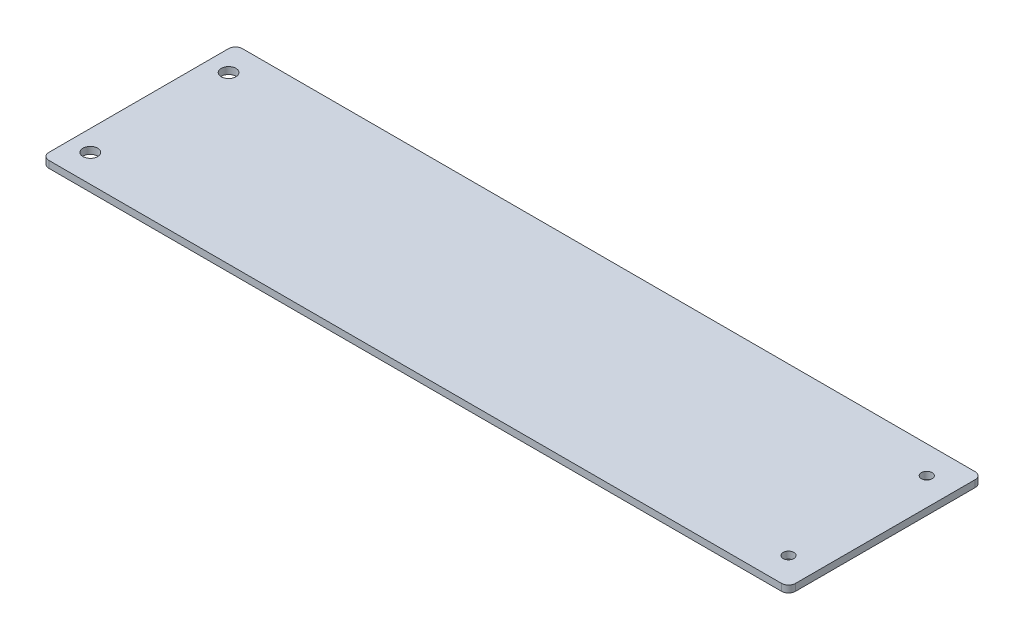
ISO-10303-21;
HEADER;
FILE_DESCRIPTION(('STEP AP214'),'2;1');
FILE_NAME('part.step','',(''),(''),'','','');
FILE_SCHEMA(('AUTOMOTIVE_DESIGN { 1 0 10303 214 1 1 1 1 }'));
ENDSEC;
DATA;
#1=APPLICATION_CONTEXT('core data for automotive mechanical design processes');
#2=APPLICATION_PROTOCOL_DEFINITION('international standard','automotive_design',2000,#1);
#3=PRODUCT_CONTEXT('',#1,'mechanical');
#4=PRODUCT('Part','Part','',(#3));
#5=PRODUCT_RELATED_PRODUCT_CATEGORY('part','',(#4));
#6=PRODUCT_DEFINITION_FORMATION('','',#4);
#7=PRODUCT_DEFINITION_CONTEXT('part definition',#1,'design');
#8=PRODUCT_DEFINITION('design','',#6,#7);
#9=PRODUCT_DEFINITION_SHAPE('','',#8);
#10=(LENGTH_UNIT() NAMED_UNIT(*) SI_UNIT(.MILLI.,.METRE.));
#11=(NAMED_UNIT(*) PLANE_ANGLE_UNIT() SI_UNIT($,.RADIAN.));
#12=(NAMED_UNIT(*) SI_UNIT($,.STERADIAN.) SOLID_ANGLE_UNIT());
#13=UNCERTAINTY_MEASURE_WITH_UNIT(LENGTH_MEASURE(1.E-05),#10,'distance_accuracy_value','');
#14=(GEOMETRIC_REPRESENTATION_CONTEXT(3) GLOBAL_UNCERTAINTY_ASSIGNED_CONTEXT((#13)) GLOBAL_UNIT_ASSIGNED_CONTEXT((#10,
#11,#12)) REPRESENTATION_CONTEXT('',''));
#15=CARTESIAN_POINT('',(0.,0.,0.));
#16=DIRECTION('',(0.,0.,1.));
#17=DIRECTION('',(1.,0.,0.));
#18=AXIS2_PLACEMENT_3D('',#15,#16,#17);
#19=CARTESIAN_POINT('',(171.45,3.175,44.45));
#20=DIRECTION('',(-1.,0.,0.));
#21=DIRECTION('',(0.,0.,1.));
#22=AXIS2_PLACEMENT_3D('',#19,#20,#21);
#23=PLANE('',#22);
#24=DIRECTION('',(0.,0.,-1.));
#25=VECTOR('',#24,1.);
#26=CARTESIAN_POINT('',(171.45,3.175,44.45));
#27=LINE('',#26,#25);
#28=CARTESIAN_POINT('',(171.45,3.175,41.275));
#29=VERTEX_POINT('',#28);
#30=CARTESIAN_POINT('',(171.45,3.175,-41.275));
#31=VERTEX_POINT('',#30);
#32=EDGE_CURVE('E138',#29,#31,#27,.T.);
#33=ORIENTED_EDGE('',*,*,#32,.F.);
#34=DIRECTION('',(0.,-1.,0.));
#35=VECTOR('',#34,1.);
#36=CARTESIAN_POINT('',(171.45,3.175,41.275));
#37=LINE('',#36,#35);
#38=CARTESIAN_POINT('',(171.45,0.,41.275));
#39=VERTEX_POINT('',#38);
#40=EDGE_CURVE('E11',#29,#39,#37,.T.);
#41=ORIENTED_EDGE('',*,*,#40,.T.);
#42=DIRECTION('',(0.,0.,-1.));
#43=VECTOR('',#42,1.);
#44=CARTESIAN_POINT('',(171.45,0.,44.45));
#45=LINE('',#44,#43);
#46=CARTESIAN_POINT('',(171.45,0.,-41.275));
#47=VERTEX_POINT('',#46);
#48=EDGE_CURVE('E140',#39,#47,#45,.T.);
#49=ORIENTED_EDGE('',*,*,#48,.T.);
#50=DIRECTION('',(0.,-1.,0.));
#51=VECTOR('',#50,1.);
#52=CARTESIAN_POINT('',(171.45,3.175,-41.275));
#53=LINE('',#52,#51);
#54=EDGE_CURVE('E45',#47,#31,#53,.F.);
#55=ORIENTED_EDGE('',*,*,#54,.T.);
#56=EDGE_LOOP('',(#33,#41,#49,#55));
#57=FACE_BOUND('',#56,.T.);
#58=ADVANCED_FACE('F36',(#57),#23,.F.);
#59=CARTESIAN_POINT('',(-171.45,3.175,-44.45));
#60=DIRECTION('',(0.,0.,1.));
#61=DIRECTION('',(1.,0.,0.));
#62=AXIS2_PLACEMENT_3D('',#59,#60,#61);
#63=PLANE('',#62);
#64=DIRECTION('',(-1.,0.,0.));
#65=VECTOR('',#64,1.);
#66=CARTESIAN_POINT('',(-171.45,0.,-44.45));
#67=LINE('',#66,#65);
#68=CARTESIAN_POINT('',(168.275,0.,-44.45));
#69=VERTEX_POINT('',#68);
#70=CARTESIAN_POINT('',(-168.275,0.,-44.45));
#71=VERTEX_POINT('',#70);
#72=EDGE_CURVE('E133',#69,#71,#67,.T.);
#73=ORIENTED_EDGE('',*,*,#72,.T.);
#74=DIRECTION('',(0.,-1.,0.));
#75=VECTOR('',#74,1.);
#76=CARTESIAN_POINT('',(-168.275,3.175,-44.45));
#77=LINE('',#76,#75);
#78=CARTESIAN_POINT('',(-168.275,3.175,-44.45));
#79=VERTEX_POINT('',#78);
#80=EDGE_CURVE('E109',#71,#79,#77,.F.);
#81=ORIENTED_EDGE('',*,*,#80,.T.);
#82=DIRECTION('',(-1.,0.,0.));
#83=VECTOR('',#82,1.);
#84=CARTESIAN_POINT('',(-171.45,3.175,-44.45));
#85=LINE('',#84,#83);
#86=CARTESIAN_POINT('',(168.275,3.175,-44.45));
#87=VERTEX_POINT('',#86);
#88=EDGE_CURVE('E191',#87,#79,#85,.T.);
#89=ORIENTED_EDGE('',*,*,#88,.F.);
#90=DIRECTION('',(0.,-1.,0.));
#91=VECTOR('',#90,1.);
#92=CARTESIAN_POINT('',(168.275,3.175,-44.45));
#93=LINE('',#92,#91);
#94=EDGE_CURVE('E115',#87,#69,#93,.T.);
#95=ORIENTED_EDGE('',*,*,#94,.T.);
#96=EDGE_LOOP('',(#73,#81,#89,#95));
#97=FACE_BOUND('',#96,.T.);
#98=ADVANCED_FACE('F195',(#97),#63,.F.);
#99=CARTESIAN_POINT('',(-171.45,3.175,44.45));
#100=DIRECTION('',(1.,0.,0.));
#101=DIRECTION('',(0.,0.,-1.));
#102=AXIS2_PLACEMENT_3D('',#99,#100,#101);
#103=PLANE('',#102);
#104=DIRECTION('',(0.,0.,1.));
#105=VECTOR('',#104,1.);
#106=CARTESIAN_POINT('',(-171.45,3.175,44.45));
#107=LINE('',#106,#105);
#108=CARTESIAN_POINT('',(-171.45,3.175,-41.275));
#109=VERTEX_POINT('',#108);
#110=CARTESIAN_POINT('',(-171.45,3.175,41.275));
#111=VERTEX_POINT('',#110);
#112=EDGE_CURVE('E124',#109,#111,#107,.T.);
#113=ORIENTED_EDGE('',*,*,#112,.F.);
#114=DIRECTION('',(0.,-1.,0.));
#115=VECTOR('',#114,1.);
#116=CARTESIAN_POINT('',(-171.45,3.175,-41.275));
#117=LINE('',#116,#115);
#118=CARTESIAN_POINT('',(-171.45,0.,-41.275));
#119=VERTEX_POINT('',#118);
#120=EDGE_CURVE('E108',#109,#119,#117,.T.);
#121=ORIENTED_EDGE('',*,*,#120,.T.);
#122=DIRECTION('',(0.,0.,1.));
#123=VECTOR('',#122,1.);
#124=CARTESIAN_POINT('',(-171.45,0.,44.45));
#125=LINE('',#124,#123);
#126=CARTESIAN_POINT('',(-171.45,0.,41.275));
#127=VERTEX_POINT('',#126);
#128=EDGE_CURVE('E122',#119,#127,#125,.T.);
#129=ORIENTED_EDGE('',*,*,#128,.T.);
#130=DIRECTION('',(0.,-1.,0.));
#131=VECTOR('',#130,1.);
#132=CARTESIAN_POINT('',(-171.45,3.175,41.275));
#133=LINE('',#132,#131);
#134=EDGE_CURVE('E127',#127,#111,#133,.F.);
#135=ORIENTED_EDGE('',*,*,#134,.T.);
#136=EDGE_LOOP('',(#113,#121,#129,#135));
#137=FACE_BOUND('',#136,.T.);
#138=ADVANCED_FACE('F121',(#137),#103,.F.);
#139=CARTESIAN_POINT('',(-171.45,3.175,44.45));
#140=DIRECTION('',(0.,0.,-1.));
#141=DIRECTION('',(-1.,0.,0.));
#142=AXIS2_PLACEMENT_3D('',#139,#140,#141);
#143=PLANE('',#142);
#144=DIRECTION('',(1.,0.,0.));
#145=VECTOR('',#144,1.);
#146=CARTESIAN_POINT('',(-171.45,3.175,44.45));
#147=LINE('',#146,#145);
#148=CARTESIAN_POINT('',(-168.275,3.175,44.45));
#149=VERTEX_POINT('',#148);
#150=CARTESIAN_POINT('',(168.275,3.175,44.45));
#151=VERTEX_POINT('',#150);
#152=EDGE_CURVE('E145',#149,#151,#147,.T.);
#153=ORIENTED_EDGE('',*,*,#152,.F.);
#154=DIRECTION('',(0.,-1.,0.));
#155=VECTOR('',#154,1.);
#156=CARTESIAN_POINT('',(-168.275,3.175,44.45));
#157=LINE('',#156,#155);
#158=CARTESIAN_POINT('',(-168.275,0.,44.45));
#159=VERTEX_POINT('',#158);
#160=EDGE_CURVE('E172',#149,#159,#157,.T.);
#161=ORIENTED_EDGE('',*,*,#160,.T.);
#162=DIRECTION('',(1.,0.,0.));
#163=VECTOR('',#162,1.);
#164=CARTESIAN_POINT('',(-171.45,0.,44.45));
#165=LINE('',#164,#163);
#166=CARTESIAN_POINT('',(168.275,0.,44.45));
#167=VERTEX_POINT('',#166);
#168=EDGE_CURVE('E132',#159,#167,#165,.T.);
#169=ORIENTED_EDGE('',*,*,#168,.T.);
#170=DIRECTION('',(0.,-1.,0.));
#171=VECTOR('',#170,1.);
#172=CARTESIAN_POINT('',(168.275,3.175,44.45));
#173=LINE('',#172,#171);
#174=EDGE_CURVE('E52',#167,#151,#173,.F.);
#175=ORIENTED_EDGE('',*,*,#174,.T.);
#176=EDGE_LOOP('',(#153,#161,#169,#175));
#177=FACE_BOUND('',#176,.T.);
#178=ADVANCED_FACE('F243',(#177),#143,.F.);
#179=CARTESIAN_POINT('',(0.,3.175,0.));
#180=DIRECTION('',(0.,-1.,0.));
#181=DIRECTION('',(0.,0.,-1.));
#182=AXIS2_PLACEMENT_3D('',#179,#180,#181);
#183=PLANE('',#182);
#184=CARTESIAN_POINT('',(158.75,3.175,-31.75));
#185=DIRECTION('',(0.,1.,0.));
#186=DIRECTION('',(0.,0.,1.));
#187=AXIS2_PLACEMENT_3D('',#184,#185,#186);
#188=CIRCLE('',#187,2.45745);
#189=CARTESIAN_POINT('',(158.75,3.175,-29.29255));
#190=VERTEX_POINT('',#189);
#191=EDGE_CURVE('E233',#190,#190,#188,.T.);
#192=ORIENTED_EDGE('',*,*,#191,.F.);
#193=EDGE_LOOP('',(#192));
#194=FACE_BOUND('',#193,.T.);
#195=CARTESIAN_POINT('',(158.75,3.175,31.75));
#196=DIRECTION('',(0.,1.,0.));
#197=DIRECTION('',(0.,0.,1.));
#198=AXIS2_PLACEMENT_3D('',#195,#196,#197);
#199=CIRCLE('',#198,2.45745);
#200=CARTESIAN_POINT('',(158.75,3.175,34.20745));
#201=VERTEX_POINT('',#200);
#202=EDGE_CURVE('E225',#201,#201,#199,.T.);
#203=ORIENTED_EDGE('',*,*,#202,.F.);
#204=EDGE_LOOP('',(#203));
#205=FACE_BOUND('',#204,.T.);
#206=CARTESIAN_POINT('',(-161.925,3.175,-31.75));
#207=DIRECTION('',(0.,1.,0.));
#208=DIRECTION('',(0.,0.,1.));
#209=AXIS2_PLACEMENT_3D('',#206,#207,#208);
#210=CIRCLE('',#209,3.373501);
#211=CARTESIAN_POINT('',(-161.925,3.175,-28.376499));
#212=VERTEX_POINT('',#211);
#213=EDGE_CURVE('E217',#212,#212,#210,.T.);
#214=ORIENTED_EDGE('',*,*,#213,.F.);
#215=EDGE_LOOP('',(#214));
#216=FACE_BOUND('',#215,.T.);
#217=CARTESIAN_POINT('',(-161.925,3.175,31.75));
#218=DIRECTION('',(0.,1.,0.));
#219=DIRECTION('',(0.,0.,1.));
#220=AXIS2_PLACEMENT_3D('',#217,#218,#219);
#221=CIRCLE('',#220,3.373501);
#222=CARTESIAN_POINT('',(-161.925,3.175,35.123501));
#223=VERTEX_POINT('',#222);
#224=EDGE_CURVE('E201',#223,#223,#221,.T.);
#225=ORIENTED_EDGE('',*,*,#224,.F.);
#226=EDGE_LOOP('',(#225));
#227=FACE_BOUND('',#226,.T.);
#228=ORIENTED_EDGE('',*,*,#88,.T.);
#229=CARTESIAN_POINT('',(-168.275,3.175,-41.275));
#230=DIRECTION('',(0.,-1.,0.));
#231=DIRECTION('',(0.,0.,-1.));
#232=AXIS2_PLACEMENT_3D('',#229,#230,#231);
#233=CIRCLE('',#232,3.175);
#234=EDGE_CURVE('E167',#79,#109,#233,.F.);
#235=ORIENTED_EDGE('',*,*,#234,.T.);
#236=ORIENTED_EDGE('',*,*,#112,.T.);
#237=CARTESIAN_POINT('',(-168.275,3.175,41.275));
#238=DIRECTION('',(0.,-1.,0.));
#239=DIRECTION('',(0.,0.,-1.));
#240=AXIS2_PLACEMENT_3D('',#237,#238,#239);
#241=CIRCLE('',#240,3.175);
#242=EDGE_CURVE('E59',#111,#149,#241,.F.);
#243=ORIENTED_EDGE('',*,*,#242,.T.);
#244=ORIENTED_EDGE('',*,*,#152,.T.);
#245=CARTESIAN_POINT('',(168.275,3.175,41.275));
#246=DIRECTION('',(0.,-1.,0.));
#247=DIRECTION('',(0.,0.,-1.));
#248=AXIS2_PLACEMENT_3D('',#245,#246,#247);
#249=CIRCLE('',#248,3.175);
#250=EDGE_CURVE('E162',#151,#29,#249,.F.);
#251=ORIENTED_EDGE('',*,*,#250,.T.);
#252=ORIENTED_EDGE('',*,*,#32,.T.);
#253=CARTESIAN_POINT('',(168.275,3.175,-41.275));
#254=DIRECTION('',(0.,-1.,0.));
#255=DIRECTION('',(0.,0.,-1.));
#256=AXIS2_PLACEMENT_3D('',#253,#254,#255);
#257=CIRCLE('',#256,3.175);
#258=EDGE_CURVE('E159',#31,#87,#257,.F.);
#259=ORIENTED_EDGE('',*,*,#258,.T.);
#260=EDGE_LOOP('',(#228,#235,#236,#243,#244,#251,#252,#259));
#261=FACE_BOUND('',#260,.T.);
#262=ADVANCED_FACE('F187',(#194,#205,#216,#227,#261),#183,.F.);
#263=CARTESIAN_POINT('',(0.,0.,0.));
#264=DIRECTION('',(0.,-1.,0.));
#265=DIRECTION('',(0.,0.,-1.));
#266=AXIS2_PLACEMENT_3D('',#263,#264,#265);
#267=PLANE('',#266);
#268=CARTESIAN_POINT('',(158.75,0.,-31.75));
#269=DIRECTION('',(0.,1.,0.));
#270=DIRECTION('',(0.,0.,1.));
#271=AXIS2_PLACEMENT_3D('',#268,#269,#270);
#272=CIRCLE('',#271,2.45745);
#273=CARTESIAN_POINT('',(158.75,0.,-29.29255));
#274=VERTEX_POINT('',#273);
#275=EDGE_CURVE('E229',#274,#274,#272,.T.);
#276=ORIENTED_EDGE('',*,*,#275,.T.);
#277=EDGE_LOOP('',(#276));
#278=FACE_BOUND('',#277,.T.);
#279=CARTESIAN_POINT('',(158.75,0.,31.75));
#280=DIRECTION('',(0.,1.,0.));
#281=DIRECTION('',(0.,0.,1.));
#282=AXIS2_PLACEMENT_3D('',#279,#280,#281);
#283=CIRCLE('',#282,2.45745);
#284=CARTESIAN_POINT('',(158.75,0.,34.20745));
#285=VERTEX_POINT('',#284);
#286=EDGE_CURVE('E221',#285,#285,#283,.T.);
#287=ORIENTED_EDGE('',*,*,#286,.T.);
#288=EDGE_LOOP('',(#287));
#289=FACE_BOUND('',#288,.T.);
#290=CARTESIAN_POINT('',(-161.925,0.,-31.75));
#291=DIRECTION('',(0.,1.,0.));
#292=DIRECTION('',(0.,0.,1.));
#293=AXIS2_PLACEMENT_3D('',#290,#291,#292);
#294=CIRCLE('',#293,3.373501);
#295=CARTESIAN_POINT('',(-161.925,0.,-28.376499));
#296=VERTEX_POINT('',#295);
#297=EDGE_CURVE('E213',#296,#296,#294,.T.);
#298=ORIENTED_EDGE('',*,*,#297,.T.);
#299=EDGE_LOOP('',(#298));
#300=FACE_BOUND('',#299,.T.);
#301=CARTESIAN_POINT('',(-161.925,0.,31.75));
#302=DIRECTION('',(0.,1.,0.));
#303=DIRECTION('',(0.,0.,1.));
#304=AXIS2_PLACEMENT_3D('',#301,#302,#303);
#305=CIRCLE('',#304,3.373501);
#306=CARTESIAN_POINT('',(-161.925,0.,35.123501));
#307=VERTEX_POINT('',#306);
#308=EDGE_CURVE('E197',#307,#307,#305,.T.);
#309=ORIENTED_EDGE('',*,*,#308,.T.);
#310=EDGE_LOOP('',(#309));
#311=FACE_BOUND('',#310,.T.);
#312=ORIENTED_EDGE('',*,*,#128,.F.);
#313=CARTESIAN_POINT('',(-168.275,0.,-41.275));
#314=DIRECTION('',(0.,-1.,0.));
#315=DIRECTION('',(0.,0.,-1.));
#316=AXIS2_PLACEMENT_3D('',#313,#314,#315);
#317=CIRCLE('',#316,3.175);
#318=EDGE_CURVE('E104',#119,#71,#317,.T.);
#319=ORIENTED_EDGE('',*,*,#318,.T.);
#320=ORIENTED_EDGE('',*,*,#72,.F.);
#321=CARTESIAN_POINT('',(168.275,0.,-41.275));
#322=DIRECTION('',(0.,-1.,0.));
#323=DIRECTION('',(0.,0.,-1.));
#324=AXIS2_PLACEMENT_3D('',#321,#322,#323);
#325=CIRCLE('',#324,3.175);
#326=EDGE_CURVE('E126',#69,#47,#325,.T.);
#327=ORIENTED_EDGE('',*,*,#326,.T.);
#328=ORIENTED_EDGE('',*,*,#48,.F.);
#329=CARTESIAN_POINT('',(168.275,0.,41.275));
#330=DIRECTION('',(0.,-1.,0.));
#331=DIRECTION('',(0.,0.,-1.));
#332=AXIS2_PLACEMENT_3D('',#329,#330,#331);
#333=CIRCLE('',#332,3.175);
#334=EDGE_CURVE('E149',#39,#167,#333,.T.);
#335=ORIENTED_EDGE('',*,*,#334,.T.);
#336=ORIENTED_EDGE('',*,*,#168,.F.);
#337=CARTESIAN_POINT('',(-168.275,0.,41.275));
#338=DIRECTION('',(0.,-1.,0.));
#339=DIRECTION('',(0.,0.,-1.));
#340=AXIS2_PLACEMENT_3D('',#337,#338,#339);
#341=CIRCLE('',#340,3.175);
#342=EDGE_CURVE('E116',#159,#127,#341,.T.);
#343=ORIENTED_EDGE('',*,*,#342,.T.);
#344=EDGE_LOOP('',(#312,#319,#320,#327,#328,#335,#336,#343));
#345=FACE_BOUND('',#344,.T.);
#346=ADVANCED_FACE('F129',(#278,#289,#300,#311,#345),#267,.T.);
#347=CARTESIAN_POINT('',(-161.925,3.175,31.75));
#348=DIRECTION('',(0.,1.,0.));
#349=DIRECTION('',(0.,0.,1.));
#350=AXIS2_PLACEMENT_3D('',#347,#348,#349);
#351=CYLINDRICAL_SURFACE('',#350,3.373501);
#352=ORIENTED_EDGE('',*,*,#308,.F.);
#353=EDGE_LOOP('',(#352));
#354=FACE_BOUND('',#353,.T.);
#355=ORIENTED_EDGE('',*,*,#224,.T.);
#356=EDGE_LOOP('',(#355));
#357=FACE_BOUND('',#356,.T.);
#358=ADVANCED_FACE('F251',(#354,#357),#351,.F.);
#359=CARTESIAN_POINT('',(-161.925,3.175,-31.75));
#360=DIRECTION('',(0.,1.,0.));
#361=DIRECTION('',(0.,0.,1.));
#362=AXIS2_PLACEMENT_3D('',#359,#360,#361);
#363=CYLINDRICAL_SURFACE('',#362,3.373501);
#364=ORIENTED_EDGE('',*,*,#297,.F.);
#365=EDGE_LOOP('',(#364));
#366=FACE_BOUND('',#365,.T.);
#367=ORIENTED_EDGE('',*,*,#213,.T.);
#368=EDGE_LOOP('',(#367));
#369=FACE_BOUND('',#368,.T.);
#370=ADVANCED_FACE('F253',(#366,#369),#363,.F.);
#371=CARTESIAN_POINT('',(158.75,3.175,31.75));
#372=DIRECTION('',(0.,1.,0.));
#373=DIRECTION('',(0.,0.,1.));
#374=AXIS2_PLACEMENT_3D('',#371,#372,#373);
#375=CYLINDRICAL_SURFACE('',#374,2.45745);
#376=ORIENTED_EDGE('',*,*,#286,.F.);
#377=EDGE_LOOP('',(#376));
#378=FACE_BOUND('',#377,.T.);
#379=ORIENTED_EDGE('',*,*,#202,.T.);
#380=EDGE_LOOP('',(#379));
#381=FACE_BOUND('',#380,.T.);
#382=ADVANCED_FACE('F260',(#378,#381),#375,.F.);
#383=CARTESIAN_POINT('',(158.75,3.175,-31.75));
#384=DIRECTION('',(0.,1.,0.));
#385=DIRECTION('',(0.,0.,1.));
#386=AXIS2_PLACEMENT_3D('',#383,#384,#385);
#387=CYLINDRICAL_SURFACE('',#386,2.45745);
#388=ORIENTED_EDGE('',*,*,#275,.F.);
#389=EDGE_LOOP('',(#388));
#390=FACE_BOUND('',#389,.T.);
#391=ORIENTED_EDGE('',*,*,#191,.T.);
#392=EDGE_LOOP('',(#391));
#393=FACE_BOUND('',#392,.T.);
#394=ADVANCED_FACE('F239',(#390,#393),#387,.F.);
#395=CARTESIAN_POINT('',(-168.275,3.175,-41.275));
#396=DIRECTION('',(0.,-1.,0.));
#397=DIRECTION('',(0.,0.,-1.));
#398=AXIS2_PLACEMENT_3D('',#395,#396,#397);
#399=CYLINDRICAL_SURFACE('',#398,3.175);
#400=ORIENTED_EDGE('',*,*,#234,.F.);
#401=ORIENTED_EDGE('',*,*,#80,.F.);
#402=ORIENTED_EDGE('',*,*,#318,.F.);
#403=ORIENTED_EDGE('',*,*,#120,.F.);
#404=EDGE_LOOP('',(#400,#401,#402,#403));
#405=FACE_BOUND('',#404,.T.);
#406=ADVANCED_FACE('F107',(#405),#399,.T.);
#407=CARTESIAN_POINT('',(-168.275,3.175,41.275));
#408=DIRECTION('',(0.,-1.,0.));
#409=DIRECTION('',(0.,0.,-1.));
#410=AXIS2_PLACEMENT_3D('',#407,#408,#409);
#411=CYLINDRICAL_SURFACE('',#410,3.175);
#412=ORIENTED_EDGE('',*,*,#242,.F.);
#413=ORIENTED_EDGE('',*,*,#134,.F.);
#414=ORIENTED_EDGE('',*,*,#342,.F.);
#415=ORIENTED_EDGE('',*,*,#160,.F.);
#416=EDGE_LOOP('',(#412,#413,#414,#415));
#417=FACE_BOUND('',#416,.T.);
#418=ADVANCED_FACE('F276',(#417),#411,.T.);
#419=CARTESIAN_POINT('',(168.275,3.175,41.275));
#420=DIRECTION('',(0.,-1.,0.));
#421=DIRECTION('',(0.,0.,-1.));
#422=AXIS2_PLACEMENT_3D('',#419,#420,#421);
#423=CYLINDRICAL_SURFACE('',#422,3.175);
#424=ORIENTED_EDGE('',*,*,#250,.F.);
#425=ORIENTED_EDGE('',*,*,#174,.F.);
#426=ORIENTED_EDGE('',*,*,#334,.F.);
#427=ORIENTED_EDGE('',*,*,#40,.F.);
#428=EDGE_LOOP('',(#424,#425,#426,#427));
#429=FACE_BOUND('',#428,.T.);
#430=ADVANCED_FACE('F278',(#429),#423,.T.);
#431=CARTESIAN_POINT('',(168.275,3.175,-41.275));
#432=DIRECTION('',(0.,-1.,0.));
#433=DIRECTION('',(0.,0.,-1.));
#434=AXIS2_PLACEMENT_3D('',#431,#432,#433);
#435=CYLINDRICAL_SURFACE('',#434,3.175);
#436=ORIENTED_EDGE('',*,*,#258,.F.);
#437=ORIENTED_EDGE('',*,*,#54,.F.);
#438=ORIENTED_EDGE('',*,*,#326,.F.);
#439=ORIENTED_EDGE('',*,*,#94,.F.);
#440=EDGE_LOOP('',(#436,#437,#438,#439));
#441=FACE_BOUND('',#440,.T.);
#442=ADVANCED_FACE('F38',(#441),#435,.T.);
#443=CLOSED_SHELL('',(#58,#98,#138,#178,#262,#346,#358,#370,#382,#394,#406,#418,#430,#442));
#444=MANIFOLD_SOLID_BREP('B2',#443);
#445=ADVANCED_BREP_SHAPE_REPRESENTATION('',(#18,#444),#14);
#446=SHAPE_DEFINITION_REPRESENTATION(#9,#445);
ENDSEC;
END-ISO-10303-21;
